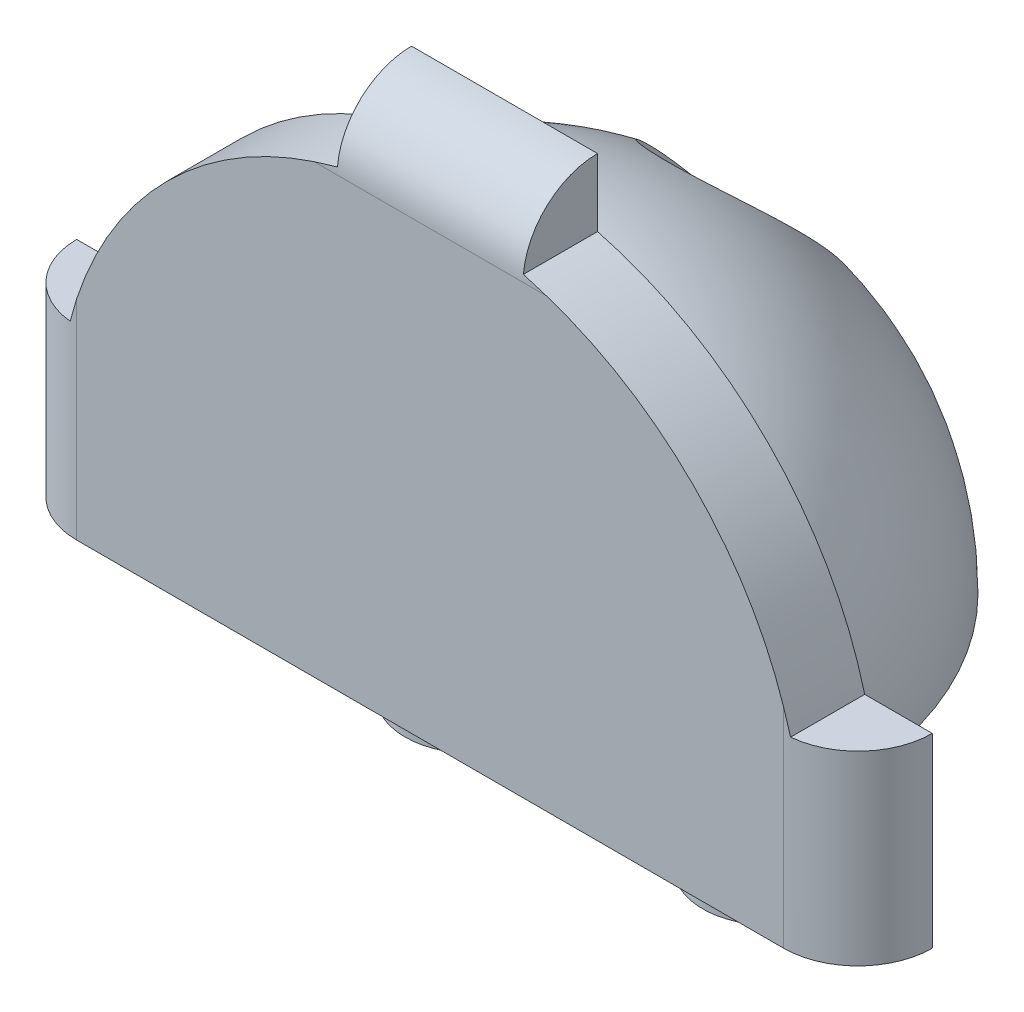
ISO-10303-21;
HEADER;
FILE_DESCRIPTION(('STEP AP214'),'2;1');
FILE_NAME('part.step','',(''),(''),'','','');
FILE_SCHEMA(('AUTOMOTIVE_DESIGN { 1 0 10303 214 1 1 1 1 }'));
ENDSEC;
DATA;
#1=APPLICATION_CONTEXT('core data for automotive mechanical design processes');
#2=APPLICATION_PROTOCOL_DEFINITION('international standard','automotive_design',2000,#1);
#3=PRODUCT_CONTEXT('',#1,'mechanical');
#4=PRODUCT('Part','Part','',(#3));
#5=PRODUCT_RELATED_PRODUCT_CATEGORY('part','',(#4));
#6=PRODUCT_DEFINITION_FORMATION('','',#4);
#7=PRODUCT_DEFINITION_CONTEXT('part definition',#1,'design');
#8=PRODUCT_DEFINITION('design','',#6,#7);
#9=PRODUCT_DEFINITION_SHAPE('','',#8);
#10=(LENGTH_UNIT() NAMED_UNIT(*) SI_UNIT(.MILLI.,.METRE.));
#11=(NAMED_UNIT(*) PLANE_ANGLE_UNIT() SI_UNIT($,.RADIAN.));
#12=(NAMED_UNIT(*) SI_UNIT($,.STERADIAN.) SOLID_ANGLE_UNIT());
#13=UNCERTAINTY_MEASURE_WITH_UNIT(LENGTH_MEASURE(1.E-05),#10,'distance_accuracy_value','');
#14=(GEOMETRIC_REPRESENTATION_CONTEXT(3) GLOBAL_UNCERTAINTY_ASSIGNED_CONTEXT((#13)) GLOBAL_UNIT_ASSIGNED_CONTEXT((#10,
#11,#12)) REPRESENTATION_CONTEXT('',''));
#15=CARTESIAN_POINT('',(0.,0.,0.));
#16=DIRECTION('',(0.,0.,1.));
#17=DIRECTION('',(1.,0.,0.));
#18=AXIS2_PLACEMENT_3D('',#15,#16,#17);
#19=CARTESIAN_POINT('',(0.,0.,2.));
#20=DIRECTION('',(0.,0.,-1.));
#21=DIRECTION('',(-1.,0.,0.));
#22=AXIS2_PLACEMENT_3D('',#19,#20,#21);
#23=CYLINDRICAL_SURFACE('',#22,10.);
#24=CARTESIAN_POINT('',(0.,0.,2.));
#25=DIRECTION('',(0.,0.,1.));
#26=DIRECTION('',(1.,0.,0.));
#27=AXIS2_PLACEMENT_3D('',#24,#25,#26);
#28=CIRCLE('',#27,10.);
#29=CARTESIAN_POINT('',(9.49999999999999,3.12249899919923,2.));
#30=VERTEX_POINT('',#29);
#31=CARTESIAN_POINT('',(3.12249899919921,9.5,2.));
#32=VERTEX_POINT('',#31);
#33=EDGE_CURVE('E326',#30,#32,#28,.T.);
#34=ORIENTED_EDGE('',*,*,#33,.F.);
#35=CARTESIAN_POINT('',(9.49999999999999,3.12249899919923,2.));
#36=CARTESIAN_POINT('',(9.51688678600174,3.07112224308726,1.99999946326881));
#37=CARTESIAN_POINT('',(9.53335654598108,3.01960888585066,1.99978613446517));
#38=CARTESIAN_POINT('',(9.56545273961679,2.91633955334606,1.99899326990257));
#39=CARTESIAN_POINT('',(9.58107942121032,2.86458365432631,1.99841384245216));
#40=CARTESIAN_POINT('',(9.61149013067313,2.76082957459439,1.99694808954947));
#41=CARTESIAN_POINT('',(9.62627416106261,2.70883139460734,1.99606176501513));
#42=CARTESIAN_POINT('',(9.65500016720584,2.60459125735915,1.99403657363693));
#43=CARTESIAN_POINT('',(9.66894189261384,2.55234923254531,1.99289763217678));
#44=CARTESIAN_POINT('',(9.68245836551853,2.50000000000003,1.9916598466737));
#45=B_SPLINE_CURVE_WITH_KNOTS('',3,(#35,#36,#37,#38,#39,#40,#41,#42,#43,#44),.UNSPECIFIED.,.F.,
.F.,(4,2,2,2,4),(0.,0.162239616217096,0.324431257079582,0.486622412831842,0.648861539472951),.UNSPECIFIED.);
#46=CARTESIAN_POINT('',(9.68245836551853,2.50000000000003,1.9916598466737));
#47=VERTEX_POINT('',#46);
#48=EDGE_CURVE('E160',#30,#47,#45,.T.);
#49=ORIENTED_EDGE('',*,*,#48,.T.);
#50=DIRECTION('',(0.,0.,-1.));
#51=VECTOR('',#50,1.);
#52=CARTESIAN_POINT('',(9.68245836551853,2.50000000000003,2.));
#53=LINE('',#52,#51);
#54=CARTESIAN_POINT('',(9.68245836551853,2.50000000000003,0.));
#55=VERTEX_POINT('',#54);
#56=EDGE_CURVE('E436',#47,#55,#53,.T.);
#57=ORIENTED_EDGE('',*,*,#56,.T.);
#58=CARTESIAN_POINT('',(0.,0.,0.));
#59=DIRECTION('',(0.,0.,1.));
#60=DIRECTION('',(1.,0.,0.));
#61=AXIS2_PLACEMENT_3D('',#58,#59,#60);
#62=CIRCLE('',#61,10.);
#63=CARTESIAN_POINT('',(2.5,9.68245836551854,0.));
#64=VERTEX_POINT('',#63);
#65=EDGE_CURVE('E325',#55,#64,#62,.T.);
#66=ORIENTED_EDGE('',*,*,#65,.T.);
#67=DIRECTION('',(0.,0.,-1.));
#68=VECTOR('',#67,1.);
#69=CARTESIAN_POINT('',(2.5,9.68245836551854,2.));
#70=LINE('',#69,#68);
#71=CARTESIAN_POINT('',(2.5,9.68245836551854,1.9916598466737));
#72=VERTEX_POINT('',#71);
#73=EDGE_CURVE('E415',#64,#72,#70,.F.);
#74=ORIENTED_EDGE('',*,*,#73,.T.);
#75=CARTESIAN_POINT('',(2.5,9.68245836551854,1.9916598466737));
#76=CARTESIAN_POINT('',(2.55234923254527,9.66894189261385,1.99289763217678));
#77=CARTESIAN_POINT('',(2.60459125735912,9.65500016720585,1.99403657363693));
#78=CARTESIAN_POINT('',(2.70883139460731,9.62627416106262,1.99606176501513));
#79=CARTESIAN_POINT('',(2.76082957459436,9.61149013067313,1.99694808954947));
#80=CARTESIAN_POINT('',(2.86458365432628,9.58107942121033,1.99841384245216));
#81=CARTESIAN_POINT('',(2.91633955334604,9.5654527396168,1.99899326990257));
#82=CARTESIAN_POINT('',(3.01960888585064,9.53335654598109,1.99978613446517));
#83=CARTESIAN_POINT('',(3.07112224308724,9.51688678600176,1.99999946326881));
#84=CARTESIAN_POINT('',(3.12249899919921,9.5,2.));
#85=B_SPLINE_CURVE_WITH_KNOTS('',3,(#75,#76,#77,#78,#79,#80,#81,#82,#83,#84),.UNSPECIFIED.,.F.,
.F.,(4,2,2,2,4),(0.,0.162239126641112,0.324430282393375,0.486621923255864,0.648861539472962),.UNSPECIFIED.);
#86=EDGE_CURVE('E163',#72,#32,#85,.T.);
#87=ORIENTED_EDGE('',*,*,#86,.T.);
#88=EDGE_LOOP('',(#34,#49,#57,#66,#74,#87));
#89=FACE_BOUND('',#88,.T.);
#90=ADVANCED_FACE('F38',(#89),#23,.T.);
#91=DIRECTION('',(0.,0.,-1.));
#92=VECTOR('',#91,1.);
#93=CARTESIAN_POINT('',(-9.68245836551855,2.49999999999997,2.));
#94=LINE('',#93,#92);
#95=CARTESIAN_POINT('',(-9.68245836551855,2.49999999999997,0.));
#96=VERTEX_POINT('',#95);
#97=CARTESIAN_POINT('',(-9.68245836551855,2.49999999999997,1.9916598466737));
#98=VERTEX_POINT('',#97);
#99=EDGE_CURVE('E433',#96,#98,#94,.F.);
#100=ORIENTED_EDGE('',*,*,#99,.T.);
#101=CARTESIAN_POINT('',(-9.68245836551855,2.49999999999997,1.9916598466737));
#102=CARTESIAN_POINT('',(-9.66894189261386,2.55234923254524,1.99289763217678));
#103=CARTESIAN_POINT('',(-9.65500016720586,2.60459125735908,1.99403657363693));
#104=CARTESIAN_POINT('',(-9.62627416106263,2.70883139460728,1.99606176501513));
#105=CARTESIAN_POINT('',(-9.61149013067315,2.76082957459433,1.99694808954947));
#106=CARTESIAN_POINT('',(-9.58107942121034,2.86458365432625,1.99841384245216));
#107=CARTESIAN_POINT('',(-9.56545273961681,2.916339553346,1.99899326990257));
#108=CARTESIAN_POINT('',(-9.5333565459811,3.01960888585061,1.99978613446517));
#109=CARTESIAN_POINT('',(-9.51688678600176,3.07112224308721,1.99999946326881));
#110=CARTESIAN_POINT('',(-9.50000000000001,3.12249899919917,2.));
#111=B_SPLINE_CURVE_WITH_KNOTS('',3,(#101,#102,#103,#104,#105,#106,#107,#108,#109,#110),
.UNSPECIFIED.,.F.,.F.,(4,2,2,2,4),(0.,0.162239126641112,0.324430282393375,0.486621923255865,
0.648861539472963),.UNSPECIFIED.);
#112=CARTESIAN_POINT('',(-9.50000000000001,3.12249899919917,2.));
#113=VERTEX_POINT('',#112);
#114=EDGE_CURVE('E202',#98,#113,#111,.T.);
#115=ORIENTED_EDGE('',*,*,#114,.T.);
#116=CARTESIAN_POINT('',(-3.12249899919921,9.5,2.));
#117=VERTEX_POINT('',#116);
#118=EDGE_CURVE('E329',#117,#113,#28,.T.);
#119=ORIENTED_EDGE('',*,*,#118,.F.);
#120=CARTESIAN_POINT('',(-3.12249899919921,9.5,2.));
#121=CARTESIAN_POINT('',(-3.07112224308724,9.51688678600175,1.99999946326881));
#122=CARTESIAN_POINT('',(-3.01960888585064,9.53335654598109,1.99978613446517));
#123=CARTESIAN_POINT('',(-2.91633955334604,9.5654527396168,1.99899326990257));
#124=CARTESIAN_POINT('',(-2.86458365432628,9.58107942121033,1.99841384245216));
#125=CARTESIAN_POINT('',(-2.76082957459436,9.61149013067313,1.99694808954947));
#126=CARTESIAN_POINT('',(-2.70883139460731,9.62627416106262,1.99606176501513));
#127=CARTESIAN_POINT('',(-2.60459125735912,9.65500016720585,1.99403657363693));
#128=CARTESIAN_POINT('',(-2.55234923254528,9.66894189261385,1.99289763217678));
#129=CARTESIAN_POINT('',(-2.5,9.68245836551854,1.9916598466737));
#130=B_SPLINE_CURVE_WITH_KNOTS('',3,(#120,#121,#122,#123,#124,#125,#126,#127,#128,#129),
.UNSPECIFIED.,.F.,.F.,(4,2,2,2,4),(0.,0.162239616217099,0.324431257079587,0.48662241283185,
0.648861539472962),.UNSPECIFIED.);
#131=CARTESIAN_POINT('',(-2.5,9.68245836551854,1.9916598466737));
#132=VERTEX_POINT('',#131);
#133=EDGE_CURVE('E63',#117,#132,#130,.T.);
#134=ORIENTED_EDGE('',*,*,#133,.T.);
#135=DIRECTION('',(0.,0.,-1.));
#136=VECTOR('',#135,1.);
#137=CARTESIAN_POINT('',(-2.5,9.68245836551854,2.));
#138=LINE('',#137,#136);
#139=CARTESIAN_POINT('',(-2.5,9.68245836551854,0.));
#140=VERTEX_POINT('',#139);
#141=EDGE_CURVE('E419',#132,#140,#138,.T.);
#142=ORIENTED_EDGE('',*,*,#141,.T.);
#143=EDGE_CURVE('E330',#140,#96,#62,.T.);
#144=ORIENTED_EDGE('',*,*,#143,.T.);
#145=EDGE_LOOP('',(#100,#115,#119,#134,#142,#144));
#146=FACE_BOUND('',#145,.T.);
#147=ADVANCED_FACE('F186',(#146),#23,.T.);
#148=CARTESIAN_POINT('',(-4.,-6.,-3.17735045483277));
#149=DIRECTION('',(0.,1.,0.));
#150=DIRECTION('',(0.,0.,1.));
#151=AXIS2_PLACEMENT_3D('',#148,#149,#150);
#152=CYLINDRICAL_SURFACE('',#151,1.85);
#153=CARTESIAN_POINT('',(-4.,0.,-3.17735045483277));
#154=DIRECTION('',(0.,1.,0.));
#155=DIRECTION('',(0.,0.,1.));
#156=AXIS2_PLACEMENT_3D('',#153,#154,#155);
#157=CIRCLE('',#156,1.85);
#158=CARTESIAN_POINT('',(-4.,0.,-1.32735045483277));
#159=VERTEX_POINT('',#158);
#160=EDGE_CURVE('E333',#159,#159,#157,.F.);
#161=ORIENTED_EDGE('',*,*,#160,.T.);
#162=EDGE_LOOP('',(#161));
#163=FACE_BOUND('',#162,.T.);
#164=CARTESIAN_POINT('',(-4.,-3.67575677416362,-3.17735045483277));
#165=DIRECTION('',(0.,-1.,0.));
#166=DIRECTION('',(0.,0.,-1.));
#167=AXIS2_PLACEMENT_3D('',#164,#165,#166);
#168=CIRCLE('',#167,1.85);
#169=CARTESIAN_POINT('',(-4.,-3.67575677416362,-5.02735045483277));
#170=VERTEX_POINT('',#169);
#171=EDGE_CURVE('E341',#170,#170,#168,.T.);
#172=ORIENTED_EDGE('',*,*,#171,.F.);
#173=EDGE_LOOP('',(#172));
#174=FACE_BOUND('',#173,.T.);
#175=ADVANCED_FACE('F288',(#163,#174),#152,.T.);
#176=CARTESIAN_POINT('',(4.,-6.,-3.17735045483277));
#177=DIRECTION('',(0.,1.,0.));
#178=DIRECTION('',(0.,0.,1.));
#179=AXIS2_PLACEMENT_3D('',#176,#177,#178);
#180=CYLINDRICAL_SURFACE('',#179,1.85);
#181=CARTESIAN_POINT('',(4.,0.,-3.17735045483277));
#182=DIRECTION('',(0.,1.,0.));
#183=DIRECTION('',(0.,0.,-1.));
#184=AXIS2_PLACEMENT_3D('',#181,#182,#183);
#185=CIRCLE('',#184,1.85);
#186=CARTESIAN_POINT('',(4.,0.,-5.02735045483277));
#187=VERTEX_POINT('',#186);
#188=EDGE_CURVE('E361',#187,#187,#185,.T.);
#189=ORIENTED_EDGE('',*,*,#188,.F.);
#190=EDGE_LOOP('',(#189));
#191=FACE_BOUND('',#190,.T.);
#192=CARTESIAN_POINT('',(4.,-3.67575677416362,-3.17735045483277));
#193=DIRECTION('',(0.,-1.,0.));
#194=DIRECTION('',(0.,0.,-1.));
#195=AXIS2_PLACEMENT_3D('',#192,#193,#194);
#196=CIRCLE('',#195,1.85);
#197=CARTESIAN_POINT('',(4.,-3.67575677416362,-5.02735045483277));
#198=VERTEX_POINT('',#197);
#199=EDGE_CURVE('E391',#198,#198,#196,.T.);
#200=ORIENTED_EDGE('',*,*,#199,.F.);
#201=EDGE_LOOP('',(#200));
#202=FACE_BOUND('',#201,.T.);
#203=ADVANCED_FACE('F284',(#191,#202),#180,.T.);
#204=CARTESIAN_POINT('',(0.,0.,0.));
#205=DIRECTION('',(0.,1.,0.));
#206=DIRECTION('',(0.,0.,1.));
#207=AXIS2_PLACEMENT_3D('',#204,#205,#206);
#208=PLANE('',#207);
#209=ORIENTED_EDGE('',*,*,#160,.F.);
#210=EDGE_LOOP('',(#209));
#211=FACE_BOUND('',#210,.T.);
#212=ORIENTED_EDGE('',*,*,#188,.T.);
#213=EDGE_LOOP('',(#212));
#214=FACE_BOUND('',#213,.T.);
#215=CARTESIAN_POINT('',(0.,0.,-6.5));
#216=DIRECTION('',(0.,-1.,0.));
#217=DIRECTION('',(0.,0.,-1.));
#218=AXIS2_PLACEMENT_3D('',#215,#216,#217);
#219=CIRCLE('',#218,3.);
#220=CARTESIAN_POINT('',(1.93983086556077,0.,-8.78846153846154));
#221=VERTEX_POINT('',#220);
#222=CARTESIAN_POINT('',(-1.93983086556077,0.,-8.78846153846154));
#223=VERTEX_POINT('',#222);
#224=EDGE_CURVE('E379',#221,#223,#219,.T.);
#225=ORIENTED_EDGE('',*,*,#224,.F.);
#226=CARTESIAN_POINT('',(0.,0.,0.));
#227=DIRECTION('',(0.,1.,0.));
#228=DIRECTION('',(0.,0.,1.));
#229=AXIS2_PLACEMENT_3D('',#226,#227,#228);
#230=CIRCLE('',#229,9.);
#231=CARTESIAN_POINT('',(9.,0.,0.));
#232=VERTEX_POINT('',#231);
#233=EDGE_CURVE('E321',#232,#221,#230,.T.);
#234=ORIENTED_EDGE('',*,*,#233,.F.);
#235=DIRECTION('',(1.,0.,0.));
#236=VECTOR('',#235,1.);
#237=CARTESIAN_POINT('',(0.,0.,0.));
#238=LINE('',#237,#236);
#239=CARTESIAN_POINT('',(-9.,0.,0.));
#240=VERTEX_POINT('',#239);
#241=EDGE_CURVE('E317',#240,#232,#238,.T.);
#242=ORIENTED_EDGE('',*,*,#241,.F.);
#243=EDGE_CURVE('E320',#223,#240,#230,.T.);
#244=ORIENTED_EDGE('',*,*,#243,.F.);
#245=EDGE_LOOP('',(#225,#234,#242,#244));
#246=FACE_BOUND('',#245,.T.);
#247=ADVANCED_FACE('F287',(#211,#214,#246),#208,.F.);
#248=CARTESIAN_POINT('',(0.,0.,0.));
#249=DIRECTION('',(0.,0.,1.));
#250=DIRECTION('',(1.,0.,0.));
#251=AXIS2_PLACEMENT_3D('',#248,#249,#250);
#252=PLANE('',#251);
#253=DIRECTION('',(0.,1.,0.));
#254=VECTOR('',#253,1.);
#255=CARTESIAN_POINT('',(11.5,-2.49999999999996,0.));
#256=LINE('',#255,#254);
#257=CARTESIAN_POINT('',(11.5,-2.49999999999996,0.));
#258=VERTEX_POINT('',#257);
#259=CARTESIAN_POINT('',(11.5,2.50000000000004,0.));
#260=VERTEX_POINT('',#259);
#261=EDGE_CURVE('E439',#258,#260,#256,.T.);
#262=ORIENTED_EDGE('',*,*,#261,.F.);
#263=DIRECTION('',(1.,0.,0.));
#264=VECTOR('',#263,1.);
#265=CARTESIAN_POINT('',(11.5,-2.49999999999996,0.));
#266=LINE('',#265,#264);
#267=CARTESIAN_POINT('',(-11.5,-2.50000000000004,0.));
#268=VERTEX_POINT('',#267);
#269=EDGE_CURVE('E140',#268,#258,#266,.T.);
#270=ORIENTED_EDGE('',*,*,#269,.F.);
#271=DIRECTION('',(0.,-1.,0.));
#272=VECTOR('',#271,1.);
#273=CARTESIAN_POINT('',(-11.5,-2.50000000000004,0.));
#274=LINE('',#273,#272);
#275=CARTESIAN_POINT('',(-11.5,2.49999999999996,0.));
#276=VERTEX_POINT('',#275);
#277=EDGE_CURVE('E444',#276,#268,#274,.T.);
#278=ORIENTED_EDGE('',*,*,#277,.F.);
#279=DIRECTION('',(-1.,0.,0.));
#280=VECTOR('',#279,1.);
#281=CARTESIAN_POINT('',(11.5,2.50000000000004,0.));
#282=LINE('',#281,#280);
#283=EDGE_CURVE('E156',#96,#276,#282,.T.);
#284=ORIENTED_EDGE('',*,*,#283,.F.);
#285=ORIENTED_EDGE('',*,*,#143,.F.);
#286=DIRECTION('',(0.,-1.,0.));
#287=VECTOR('',#286,1.);
#288=CARTESIAN_POINT('',(-2.5,-11.5,0.));
#289=LINE('',#288,#287);
#290=CARTESIAN_POINT('',(-2.5,11.5,0.));
#291=VERTEX_POINT('',#290);
#292=EDGE_CURVE('E422',#291,#140,#289,.T.);
#293=ORIENTED_EDGE('',*,*,#292,.F.);
#294=DIRECTION('',(-1.,0.,0.));
#295=VECTOR('',#294,1.);
#296=CARTESIAN_POINT('',(-2.5,11.5,0.));
#297=LINE('',#296,#295);
#298=CARTESIAN_POINT('',(2.5,11.5,0.));
#299=VERTEX_POINT('',#298);
#300=EDGE_CURVE('E426',#299,#291,#297,.T.);
#301=ORIENTED_EDGE('',*,*,#300,.F.);
#302=DIRECTION('',(0.,1.,0.));
#303=VECTOR('',#302,1.);
#304=CARTESIAN_POINT('',(2.5,-11.5,0.));
#305=LINE('',#304,#303);
#306=EDGE_CURVE('E430',#64,#299,#305,.T.);
#307=ORIENTED_EDGE('',*,*,#306,.F.);
#308=ORIENTED_EDGE('',*,*,#65,.F.);
#309=EDGE_CURVE('E447',#260,#55,#282,.T.);
#310=ORIENTED_EDGE('',*,*,#309,.F.);
#311=EDGE_LOOP('',(#262,#270,#278,#284,#285,#293,#301,#307,#308,#310));
#312=FACE_BOUND('',#311,.T.);
#313=CARTESIAN_POINT('',(0.,0.,0.));
#314=DIRECTION('',(0.,0.,1.));
#315=DIRECTION('',(1.,0.,0.));
#316=AXIS2_PLACEMENT_3D('',#313,#314,#315);
#317=CIRCLE('',#316,9.);
#318=EDGE_CURVE('E312',#232,#240,#317,.T.);
#319=ORIENTED_EDGE('',*,*,#318,.T.);
#320=ORIENTED_EDGE('',*,*,#241,.T.);
#321=EDGE_LOOP('',(#319,#320));
#322=FACE_BOUND('',#321,.T.);
#323=ADVANCED_FACE('F188',(#312,#322),#252,.F.);
#324=CARTESIAN_POINT('',(0.,0.,2.));
#325=DIRECTION('',(0.,0.,1.));
#326=DIRECTION('',(1.,0.,0.));
#327=AXIS2_PLACEMENT_3D('',#324,#325,#326);
#328=PLANE('',#327);
#329=DIRECTION('',(-1.,0.,0.));
#330=VECTOR('',#329,1.);
#331=CARTESIAN_POINT('',(0.,-2.5,2.));
#332=LINE('',#331,#330);
#333=CARTESIAN_POINT('',(9.50000000000001,-2.49999999999997,2.));
#334=VERTEX_POINT('',#333);
#335=CARTESIAN_POINT('',(-9.49999999999999,-2.50000000000004,2.));
#336=VERTEX_POINT('',#335);
#337=EDGE_CURVE('E137',#334,#336,#332,.T.);
#338=ORIENTED_EDGE('',*,*,#337,.F.);
#339=DIRECTION('',(0.,1.,0.));
#340=VECTOR('',#339,1.);
#341=CARTESIAN_POINT('',(9.5,0.,2.));
#342=LINE('',#341,#340);
#343=EDGE_CURVE('E151',#334,#30,#342,.T.);
#344=ORIENTED_EDGE('',*,*,#343,.T.);
#345=ORIENTED_EDGE('',*,*,#33,.T.);
#346=DIRECTION('',(-1.,0.,0.));
#347=VECTOR('',#346,1.);
#348=CARTESIAN_POINT('',(0.,9.5,2.));
#349=LINE('',#348,#347);
#350=EDGE_CURVE('E168',#32,#117,#349,.T.);
#351=ORIENTED_EDGE('',*,*,#350,.T.);
#352=ORIENTED_EDGE('',*,*,#118,.T.);
#353=DIRECTION('',(0.,-1.,0.));
#354=VECTOR('',#353,1.);
#355=CARTESIAN_POINT('',(-9.5,0.,2.));
#356=LINE('',#355,#354);
#357=EDGE_CURVE('E154',#113,#336,#356,.T.);
#358=ORIENTED_EDGE('',*,*,#357,.T.);
#359=EDGE_LOOP('',(#338,#344,#345,#351,#352,#358));
#360=FACE_BOUND('',#359,.T.);
#361=ADVANCED_FACE('F149',(#360),#328,.T.);
#362=CARTESIAN_POINT('',(0.,0.,0.));
#363=DIRECTION('',(0.,1.,0.));
#364=DIRECTION('',(1.,0.,0.));
#365=AXIS2_PLACEMENT_3D('',#362,#363,#364);
#366=SPHERICAL_SURFACE('',#365,9.);
#367=CARTESIAN_POINT('',(0.,2.65329983228432,-8.6));
#368=CARTESIAN_POINT('',(0.0517041748023338,2.65329859046355,-8.60000046771537));
#369=CARTESIAN_POINT('',(0.103405099392612,2.65804619798417,-8.59806758475628));
#370=CARTESIAN_POINT('',(0.205010584961247,2.67625952710847,-8.59059327712101));
#371=CARTESIAN_POINT('',(0.254911150733533,2.68974351352862,-8.58504429225611));
#372=CARTESIAN_POINT('',(0.367044692458896,2.72904151801302,-8.56867849418655));
#373=CARTESIAN_POINT('',(0.428198014546245,2.75740414217103,-8.55675171392708));
#374=CARTESIAN_POINT('',(0.545040360860403,2.8222228096887,-8.52893148264736));
#375=CARTESIAN_POINT('',(0.600714601564255,2.85869992804375,-8.51302768891259));
#376=CARTESIAN_POINT('',(0.703792686569309,2.93446936532014,-8.47924904189046));
#377=CARTESIAN_POINT('',(0.751495624577364,2.97344507209442,-8.46155852320283));
#378=CARTESIAN_POINT('',(0.843174788953082,3.05459615146302,-8.42393067081544));
#379=CARTESIAN_POINT('',(0.887147598123495,3.09677439230785,-8.40399131506961));
#380=CARTESIAN_POINT('',(1.0144089821774,3.22676669253242,-8.34118803794029));
#381=CARTESIAN_POINT('',(1.09286304639126,3.31789692965616,-8.29540083920551));
#382=CARTESIAN_POINT('',(1.23901919955226,3.50392442902953,-8.19778196437732));
#383=CARTESIAN_POINT('',(1.30679449050768,3.59878992109969,-8.1459960810227));
#384=CARTESIAN_POINT('',(1.43373059470551,3.7910702248949,-8.0366949583813));
#385=CARTESIAN_POINT('',(1.4928841508106,3.8884871037594,-7.97917496033106));
#386=CARTESIAN_POINT('',(1.60317255994397,4.08466377932361,-7.85885830927752));
#387=CARTESIAN_POINT('',(1.65430265327534,4.18342433565918,-7.79605855787327));
#388=CARTESIAN_POINT('',(1.7486918719104,4.38148011617314,-7.66557266298839));
#389=CARTESIAN_POINT('',(1.79195030706503,4.48077538644763,-7.59788609178093));
#390=CARTESIAN_POINT('',(1.87279825447269,4.68518201901891,-7.4538545913401));
#391=CARTESIAN_POINT('',(1.90990475126768,4.79029199504536,-7.37723456517277));
#392=CARTESIAN_POINT('',(1.97478403452331,4.99990204946494,-7.21938468819162));
#393=CARTESIAN_POINT('',(2.00255511847544,5.10440201319861,-7.13815399968059));
#394=CARTESIAN_POINT('',(2.07095419053532,5.41598978923732,-6.88845660997523));
#395=CARTESIAN_POINT('',(2.09685387304912,5.62162818825508,-6.7136576293617));
#396=CARTESIAN_POINT('',(2.10196433949834,5.97866023412892,-6.39385252404887));
#397=CARTESIAN_POINT('',(2.09035307739863,6.13186581173105,-6.25097010296213));
#398=CARTESIAN_POINT('',(2.03537731825612,6.43018583084771,-5.96267831393437));
#399=CARTESIAN_POINT('',(1.99205148107569,6.57530989211559,-5.81727223281682));
#400=CARTESIAN_POINT('',(1.88466394467294,6.81821959192642,-5.56636461243013));
#401=CARTESIAN_POINT('',(1.82860182470319,6.91870471421759,-5.46005888818201));
#402=CARTESIAN_POINT('',(1.69427450758489,7.11041374139215,-5.25316555383689));
#403=CARTESIAN_POINT('',(1.61603851944562,7.20164961680506,-5.15257062892643));
#404=CARTESIAN_POINT('',(1.45621692578602,7.3524753240611,-4.98349831857158));
#405=CARTESIAN_POINT('',(1.37929295884706,7.4145794314853,-4.91286926189953));
#406=CARTESIAN_POINT('',(1.21125729191796,7.5291046411275,-4.7812194446166));
#407=CARTESIAN_POINT('',(1.12016227701925,7.58153697426517,-4.72018755203477));
#408=CARTESIAN_POINT('',(0.941084663362739,7.66660602459914,-4.62035825175481));
#409=CARTESIAN_POINT('',(0.855103675884375,7.70108469262412,-4.57955113468738));
#410=CARTESIAN_POINT('',(0.675425277700717,7.76019551655464,-4.5092494152571));
#411=CARTESIAN_POINT('',(0.581731356459488,7.78483209598361,-4.47974973101443));
#412=CARTESIAN_POINT('',(0.388438738262105,7.82307406848108,-4.43383739354609));
#413=CARTESIAN_POINT('',(0.288811729380563,7.83662111118417,-4.4174939726716));
#414=CARTESIAN_POINT('',(0.0873445229693916,7.85162806142281,-4.39938440791062));
#415=CARTESIAN_POINT('',(-0.0144948609004724,7.85309233971346,-4.3976129928248));
#416=CARTESIAN_POINT('',(-0.207532780093147,7.8442821454864,-4.40824991894439));
#417=CARTESIAN_POINT('',(-0.298855307015593,7.83506521536102,-4.41938082991386));
#418=CARTESIAN_POINT('',(-0.477829841643917,7.80707617251865,-4.45305812510174));
#419=CARTESIAN_POINT('',(-0.565481814329818,7.78830396865931,-4.47560461820694));
#420=CARTESIAN_POINT('',(-0.736569837474998,7.74166714851281,-4.53131834748798));
#421=CARTESIAN_POINT('',(-0.819903811135472,7.71364748401577,-4.56466649982875));
#422=CARTESIAN_POINT('',(-0.979200504826859,7.6497540283313,-4.6401755762983));
#423=CARTESIAN_POINT('',(-1.0551608528966,7.61387772180946,-4.6823393225775));
#424=CARTESIAN_POINT('',(-1.20838921791971,7.53024447955086,-4.77979867291403));
#425=CARTESIAN_POINT('',(-1.28450228801146,7.48154389418199,-4.83609344844325));
#426=CARTESIAN_POINT('',(-1.42579416167341,7.37713284587521,-4.95543445731758));
#427=CARTESIAN_POINT('',(-1.49096509533741,7.32141738760513,-5.0184854970255));
#428=CARTESIAN_POINT('',(-1.64276012960965,7.17263561150994,-5.18472191074882));
#429=CARTESIAN_POINT('',(-1.72197092019345,7.07564374113845,-5.29119746978838));
#430=CARTESIAN_POINT('',(-1.85636734754289,6.87187850037353,-5.5098265156232));
#431=CARTESIAN_POINT('',(-1.91149844269194,6.76508358042611,-5.62199225663627));
#432=CARTESIAN_POINT('',(-2.01531738406201,6.50583190281204,-5.88740135573389));
#433=CARTESIAN_POINT('',(-2.05502471568741,6.35045770094124,-6.04130497843464));
#434=CARTESIAN_POINT('',(-2.09992425838917,6.03143867210229,-6.34518127189366));
#435=CARTESIAN_POINT('',(-2.10508245121395,5.86778585338399,-6.49514992350553));
#436=CARTESIAN_POINT('',(-2.08267531749143,5.48838960141953,-6.82790217196751));
#437=CARTESIAN_POINT('',(-2.04553449563741,5.2709006356003,-7.00810417938746));
#438=CARTESIAN_POINT('',(-1.95825551740281,4.94195505016679,-7.26379040142485));
#439=CARTESIAN_POINT('',(-1.92382285203774,4.83168058766245,-7.34670071170876));
#440=CARTESIAN_POINT('',(-1.84490234240124,4.61078977292643,-7.50713596225662));
#441=CARTESIAN_POINT('',(-1.80041732223887,4.50017352530819,-7.58466240708216));
#442=CARTESIAN_POINT('',(-1.70960197656507,4.29705073960421,-7.72184347260341));
#443=CARTESIAN_POINT('',(-1.66471064129826,4.20448372433787,-7.78237077827118));
#444=CARTESIAN_POINT('',(-1.56799561892209,4.02017637418513,-7.89897407863191));
#445=CARTESIAN_POINT('',(-1.51617316032767,3.92843589586692,-7.95505085936308));
#446=CARTESIAN_POINT('',(-1.40550539594249,3.74694770201845,-8.06219863202147));
#447=CARTESIAN_POINT('',(-1.34669158264608,3.65719305992612,-8.11329031534496));
#448=CARTESIAN_POINT('',(-1.22115409054099,3.48052229191272,-8.21028736198019));
#449=CARTESIAN_POINT('',(-1.15443806167238,3.39360352298084,-8.25619765851041));
#450=CARTESIAN_POINT('',(-1.03181515881768,3.24862959185731,-8.33000625950524));
#451=CARTESIAN_POINT('',(-0.978195937501298,3.18936984946227,-8.35932403480096));
#452=CARTESIAN_POINT('',(-0.865033612970391,3.07465180790871,-8.41460029779994));
#453=CARTESIAN_POINT('',(-0.805475887255552,3.01920348996699,-8.44055011231615));
#454=CARTESIAN_POINT('',(-0.678437427488189,2.91399278683016,-8.48857227756912));
#455=CARTESIAN_POINT('',(-0.610858085672098,2.8643201320831,-8.51058572873177));
#456=CARTESIAN_POINT('',(-0.467110213286822,2.7764227955823,-8.54872270609697));
#457=CARTESIAN_POINT('',(-0.390989474504446,2.73813839991179,-8.56487705583273));
#458=CARTESIAN_POINT('',(-0.26123616638141,2.69157653291547,-8.58428824501409));
#459=CARTESIAN_POINT('',(-0.21015010430413,2.67742243610106,-8.59011506850658));
#460=CARTESIAN_POINT('',(-0.106038309798856,2.65829553090541,-8.59796622972392));
#461=CARTESIAN_POINT('',(-0.0530174461905048,2.65330110564698,-8.5999995204048));
#462=CARTESIAN_POINT('',(0.,2.65329983228432,-8.6));
#463=B_SPLINE_CURVE_WITH_KNOTS('',3,(#367,#368,#369,#370,#371,#372,#373,#374,#375,#376,#377,
#378,#379,#380,#381,#382,#383,#384,#385,#386,#387,#388,#389,#390,#391,#392,#393,#394,#395,#396,
#397,#398,#399,#400,#401,#402,#403,#404,#405,#406,#407,#408,#409,#410,#411,#412,#413,#414,#415,
#416,#417,#418,#419,#420,#421,#422,#423,#424,#425,#426,#427,#428,#429,#430,#431,#432,#433,#434,
#435,#436,#437,#438,#439,#440,#441,#442,#443,#444,#445,#446,#447,#448,#449,#450,#451,#452,#453,
#454,#455,#456,#457,#458,#459,#460,#461,#462),.UNSPECIFIED.,.T.,.F.,(4,2,2,2,2,2,2,2,2,2,2,2,2,
2,2,2,2,2,2,2,2,2,2,2,2,2,2,2,2,2,2,2,2,2,2,2,2,2,2,2,2,2,2,2,2,2,2,4),(0.,0.154878625947738,
0.310082100185943,0.514279923817333,0.719014414617453,0.91100377153035,1.1031671533839,
1.4881928890208,1.87045224689976,2.25303152687614,2.63583691036407,3.01867584022955,
3.4240299468747,3.82945793829592,4.6385434431827,5.26595124949116,5.89259552067238,
6.3609903339272,6.8287709889522,7.19194243692626,7.55468947624443,7.85711287594358,
8.15940019821033,8.46326803809966,8.76702595362825,9.043103723932,9.31918412763519,
9.60015094659076,9.88120785001109,10.199424574841,10.517869199081,11.0082360114161,
11.499707838801,12.1628870201365,12.8267190942723,13.6765827300415,14.1028446943174,
14.528987053093,14.8868162330351,15.2445820729764,15.6007934267683,15.9566627170348,
16.211775809744,16.4675333588098,16.7268453296098,16.9847726175594,17.1439612887312,
17.3027737878888),.UNSPECIFIED.);
#464=CARTESIAN_POINT('',(0.,2.65329983228432,-8.6));
#465=VERTEX_POINT('',#464);
#466=EDGE_CURVE('E304',#465,#465,#463,.T.);
#467=ORIENTED_EDGE('',*,*,#466,.T.);
#468=EDGE_LOOP('',(#467));
#469=FACE_BOUND('',#468,.T.);
#470=ORIENTED_EDGE('',*,*,#233,.T.);
#471=CARTESIAN_POINT('',(0.,0.,0.));
#472=DIRECTION('',(0.,-1.,0.));
#473=DIRECTION('',(0.,0.,-1.));
#474=AXIS2_PLACEMENT_3D('',#471,#472,#473);
#475=CIRCLE('',#474,9.);
#476=EDGE_CURVE('E383',#223,#221,#475,.T.);
#477=ORIENTED_EDGE('',*,*,#476,.F.);
#478=ORIENTED_EDGE('',*,*,#243,.T.);
#479=ORIENTED_EDGE('',*,*,#318,.F.);
#480=EDGE_LOOP('',(#470,#477,#478,#479));
#481=FACE_BOUND('',#480,.T.);
#482=ADVANCED_FACE('F299',(#469,#481),#366,.T.);
#483=CARTESIAN_POINT('',(0.,10.,-6.5));
#484=DIRECTION('',(0.,-1.,0.));
#485=DIRECTION('',(0.,0.,-1.));
#486=AXIS2_PLACEMENT_3D('',#483,#484,#485);
#487=CYLINDRICAL_SURFACE('',#486,2.1);
#488=ORIENTED_EDGE('',*,*,#466,.F.);
#489=EDGE_LOOP('',(#488));
#490=FACE_BOUND('',#489,.T.);
#491=CARTESIAN_POINT('',(0.,-1.38,-6.5));
#492=DIRECTION('',(0.,-1.,0.));
#493=DIRECTION('',(0.,0.,-1.));
#494=AXIS2_PLACEMENT_3D('',#491,#492,#493);
#495=CIRCLE('',#494,2.1);
#496=CARTESIAN_POINT('',(0.,-1.38,-8.6));
#497=VERTEX_POINT('',#496);
#498=EDGE_CURVE('E387',#497,#497,#495,.T.);
#499=ORIENTED_EDGE('',*,*,#498,.T.);
#500=EDGE_LOOP('',(#499));
#501=FACE_BOUND('',#500,.T.);
#502=ADVANCED_FACE('F273',(#490,#501),#487,.F.);
#503=CARTESIAN_POINT('',(0.,-1.38,-3.25));
#504=DIRECTION('',(0.,-1.,0.));
#505=DIRECTION('',(0.,0.,-1.));
#506=AXIS2_PLACEMENT_3D('',#503,#504,#505);
#507=PLANE('',#506);
#508=CARTESIAN_POINT('',(0.,-1.38,0.));
#509=DIRECTION('',(0.,-1.,0.));
#510=DIRECTION('',(0.,0.,-1.));
#511=AXIS2_PLACEMENT_3D('',#508,#509,#510);
#512=CIRCLE('',#511,9.);
#513=CARTESIAN_POINT('',(-1.93983086556077,-1.38,-8.78846153846154));
#514=VERTEX_POINT('',#513);
#515=CARTESIAN_POINT('',(1.93983086556077,-1.38,-8.78846153846154));
#516=VERTEX_POINT('',#515);
#517=EDGE_CURVE('E375',#514,#516,#512,.T.);
#518=ORIENTED_EDGE('',*,*,#517,.T.);
#519=CARTESIAN_POINT('',(0.,-1.38,-6.5));
#520=DIRECTION('',(0.,-1.,0.));
#521=DIRECTION('',(0.,0.,-1.));
#522=AXIS2_PLACEMENT_3D('',#519,#520,#521);
#523=CIRCLE('',#522,3.);
#524=EDGE_CURVE('E372',#516,#514,#523,.T.);
#525=ORIENTED_EDGE('',*,*,#524,.T.);
#526=EDGE_LOOP('',(#518,#525));
#527=FACE_BOUND('',#526,.T.);
#528=ORIENTED_EDGE('',*,*,#498,.F.);
#529=EDGE_LOOP('',(#528));
#530=FACE_BOUND('',#529,.T.);
#531=ADVANCED_FACE('F269',(#527,#530),#507,.T.);
#532=CARTESIAN_POINT('',(0.,-1.38,0.));
#533=DIRECTION('',(0.,1.,0.));
#534=DIRECTION('',(0.,0.,1.));
#535=AXIS2_PLACEMENT_3D('',#532,#533,#534);
#536=CYLINDRICAL_SURFACE('',#535,9.);
#537=ORIENTED_EDGE('',*,*,#476,.T.);
#538=DIRECTION('',(0.,1.,0.));
#539=VECTOR('',#538,1.);
#540=CARTESIAN_POINT('',(1.93983086556077,-1.38,-8.78846153846154));
#541=LINE('',#540,#539);
#542=EDGE_CURVE('E365',#516,#221,#541,.T.);
#543=ORIENTED_EDGE('',*,*,#542,.F.);
#544=ORIENTED_EDGE('',*,*,#517,.F.);
#545=DIRECTION('',(0.,1.,0.));
#546=VECTOR('',#545,1.);
#547=CARTESIAN_POINT('',(-1.93983086556077,-1.38,-8.78846153846154));
#548=LINE('',#547,#546);
#549=EDGE_CURVE('E368',#514,#223,#548,.T.);
#550=ORIENTED_EDGE('',*,*,#549,.T.);
#551=EDGE_LOOP('',(#537,#543,#544,#550));
#552=FACE_BOUND('',#551,.T.);
#553=ADVANCED_FACE('F272',(#552),#536,.T.);
#554=CARTESIAN_POINT('',(0.,-1.38,-6.5));
#555=DIRECTION('',(0.,1.,0.));
#556=DIRECTION('',(0.,0.,1.));
#557=AXIS2_PLACEMENT_3D('',#554,#555,#556);
#558=CYLINDRICAL_SURFACE('',#557,3.);
#559=ORIENTED_EDGE('',*,*,#224,.T.);
#560=ORIENTED_EDGE('',*,*,#549,.F.);
#561=ORIENTED_EDGE('',*,*,#524,.F.);
#562=ORIENTED_EDGE('',*,*,#542,.T.);
#563=EDGE_LOOP('',(#559,#560,#561,#562));
#564=FACE_BOUND('',#563,.T.);
#565=ADVANCED_FACE('F267',(#564),#558,.T.);
#566=CARTESIAN_POINT('',(4.,-3.67575677416362,-3.17735045483277));
#567=DIRECTION('',(0.,-1.,0.));
#568=DIRECTION('',(0.,0.,-1.));
#569=AXIS2_PLACEMENT_3D('',#566,#567,#568);
#570=CONICAL_SURFACE('',#569,1.85,0.349065850398868);
#571=CARTESIAN_POINT('',(4.,-4.08787838708181,-3.17735045483277));
#572=DIRECTION('',(0.,-1.,0.));
#573=DIRECTION('',(0.,0.,-1.));
#574=AXIS2_PLACEMENT_3D('',#571,#572,#573);
#575=CIRCLE('',#574,2.);
#576=CARTESIAN_POINT('',(4.,-4.08787838708181,-5.17735045483277));
#577=VERTEX_POINT('',#576);
#578=EDGE_CURVE('E395',#577,#577,#575,.T.);
#579=ORIENTED_EDGE('',*,*,#578,.F.);
#580=EDGE_LOOP('',(#579));
#581=FACE_BOUND('',#580,.T.);
#582=ORIENTED_EDGE('',*,*,#199,.T.);
#583=EDGE_LOOP('',(#582));
#584=FACE_BOUND('',#583,.T.);
#585=ADVANCED_FACE('F263',(#581,#584),#570,.T.);
#586=CARTESIAN_POINT('',(4.,-5.3,-3.17735045483277));
#587=DIRECTION('',(0.,-1.,0.));
#588=DIRECTION('',(0.,0.,-1.));
#589=AXIS2_PLACEMENT_3D('',#586,#587,#588);
#590=CYLINDRICAL_SURFACE('',#589,2.);
#591=CARTESIAN_POINT('',(4.,-4.88787838708181,-3.17735045483277));
#592=DIRECTION('',(0.,-1.,0.));
#593=DIRECTION('',(0.,0.,-1.));
#594=AXIS2_PLACEMENT_3D('',#591,#592,#593);
#595=CIRCLE('',#594,2.);
#596=CARTESIAN_POINT('',(4.,-4.88787838708181,-5.17735045483277));
#597=VERTEX_POINT('',#596);
#598=EDGE_CURVE('E399',#597,#597,#595,.T.);
#599=ORIENTED_EDGE('',*,*,#598,.F.);
#600=EDGE_LOOP('',(#599));
#601=FACE_BOUND('',#600,.T.);
#602=ORIENTED_EDGE('',*,*,#578,.T.);
#603=EDGE_LOOP('',(#602));
#604=FACE_BOUND('',#603,.T.);
#605=ADVANCED_FACE('F259',(#601,#604),#590,.T.);
#606=CARTESIAN_POINT('',(4.,-4.88787838708181,-3.17735045483277));
#607=DIRECTION('',(0.,1.,0.));
#608=DIRECTION('',(0.,0.,1.));
#609=AXIS2_PLACEMENT_3D('',#606,#607,#608);
#610=CONICAL_SURFACE('',#609,2.,0.349065850398868);
#611=CARTESIAN_POINT('',(4.,-5.3,-3.17735045483277));
#612=DIRECTION('',(0.,-1.,0.));
#613=DIRECTION('',(0.,0.,-1.));
#614=AXIS2_PLACEMENT_3D('',#611,#612,#613);
#615=CIRCLE('',#614,1.85);
#616=CARTESIAN_POINT('',(4.,-5.3,-5.02735045483277));
#617=VERTEX_POINT('',#616);
#618=EDGE_CURVE('E403',#617,#617,#615,.T.);
#619=ORIENTED_EDGE('',*,*,#618,.F.);
#620=EDGE_LOOP('',(#619));
#621=FACE_BOUND('',#620,.T.);
#622=ORIENTED_EDGE('',*,*,#598,.T.);
#623=EDGE_LOOP('',(#622));
#624=FACE_BOUND('',#623,.T.);
#625=ADVANCED_FACE('F255',(#621,#624),#610,.T.);
#626=CARTESIAN_POINT('',(4.,-6.,-3.17735045483277));
#627=DIRECTION('',(0.,-1.,0.));
#628=DIRECTION('',(0.,0.,-1.));
#629=AXIS2_PLACEMENT_3D('',#626,#627,#628);
#630=PLANE('',#629);
#631=CARTESIAN_POINT('',(4.,-6.,-3.17735045483277));
#632=DIRECTION('',(0.,1.,0.));
#633=DIRECTION('',(0.,0.,-1.));
#634=AXIS2_PLACEMENT_3D('',#631,#632,#633);
#635=CIRCLE('',#634,1.85);
#636=CARTESIAN_POINT('',(4.,-6.,-5.02735045483277));
#637=VERTEX_POINT('',#636);
#638=EDGE_CURVE('E358',#637,#637,#635,.T.);
#639=ORIENTED_EDGE('',*,*,#638,.F.);
#640=EDGE_LOOP('',(#639));
#641=FACE_BOUND('',#640,.T.);
#642=ADVANCED_FACE('F258',(#641),#630,.T.);
#643=ORIENTED_EDGE('',*,*,#638,.T.);
#644=EDGE_LOOP('',(#643));
#645=FACE_BOUND('',#644,.T.);
#646=ORIENTED_EDGE('',*,*,#618,.T.);
#647=EDGE_LOOP('',(#646));
#648=FACE_BOUND('',#647,.T.);
#649=ADVANCED_FACE('F253',(#645,#648),#180,.T.);
#650=CARTESIAN_POINT('',(-4.,-3.67575677416362,-3.17735045483277));
#651=DIRECTION('',(0.,-1.,0.));
#652=DIRECTION('',(0.,0.,-1.));
#653=AXIS2_PLACEMENT_3D('',#650,#651,#652);
#654=CONICAL_SURFACE('',#653,1.85,0.349065850398868);
#655=CARTESIAN_POINT('',(-4.,-4.08787838708181,-3.17735045483277));
#656=DIRECTION('',(0.,1.,0.));
#657=DIRECTION('',(0.,0.,-1.));
#658=AXIS2_PLACEMENT_3D('',#655,#656,#657);
#659=CIRCLE('',#658,2.);
#660=CARTESIAN_POINT('',(-4.,-4.08787838708181,-5.17735045483277));
#661=VERTEX_POINT('',#660);
#662=EDGE_CURVE('E407',#661,#661,#659,.T.);
#663=ORIENTED_EDGE('',*,*,#662,.T.);
#664=EDGE_LOOP('',(#663));
#665=FACE_BOUND('',#664,.T.);
#666=ORIENTED_EDGE('',*,*,#171,.T.);
#667=EDGE_LOOP('',(#666));
#668=FACE_BOUND('',#667,.T.);
#669=ADVANCED_FACE('F249',(#665,#668),#654,.T.);
#670=CARTESIAN_POINT('',(-4.,-5.3,-3.17735045483277));
#671=DIRECTION('',(0.,-1.,0.));
#672=DIRECTION('',(0.,0.,-1.));
#673=AXIS2_PLACEMENT_3D('',#670,#671,#672);
#674=CYLINDRICAL_SURFACE('',#673,2.);
#675=CARTESIAN_POINT('',(-4.,-4.88787838708181,-3.17735045483277));
#676=DIRECTION('',(0.,1.,0.));
#677=DIRECTION('',(0.,0.,-1.));
#678=AXIS2_PLACEMENT_3D('',#675,#676,#677);
#679=CIRCLE('',#678,2.);
#680=CARTESIAN_POINT('',(-4.,-4.88787838708181,-5.17735045483277));
#681=VERTEX_POINT('',#680);
#682=EDGE_CURVE('E411',#681,#681,#679,.T.);
#683=ORIENTED_EDGE('',*,*,#682,.T.);
#684=EDGE_LOOP('',(#683));
#685=FACE_BOUND('',#684,.T.);
#686=ORIENTED_EDGE('',*,*,#662,.F.);
#687=EDGE_LOOP('',(#686));
#688=FACE_BOUND('',#687,.T.);
#689=ADVANCED_FACE('F245',(#685,#688),#674,.T.);
#690=CARTESIAN_POINT('',(-4.,-4.88787838708181,-3.17735045483277));
#691=DIRECTION('',(0.,1.,0.));
#692=DIRECTION('',(0.,0.,1.));
#693=AXIS2_PLACEMENT_3D('',#690,#691,#692);
#694=CONICAL_SURFACE('',#693,2.,0.349065850398868);
#695=CARTESIAN_POINT('',(-4.,-5.3,-3.17735045483277));
#696=DIRECTION('',(0.,1.,0.));
#697=DIRECTION('',(0.,0.,1.));
#698=AXIS2_PLACEMENT_3D('',#695,#696,#697);
#699=CIRCLE('',#698,1.85);
#700=CARTESIAN_POINT('',(-4.,-5.3,-1.32735045483277));
#701=VERTEX_POINT('',#700);
#702=EDGE_CURVE('E337',#701,#701,#699,.T.);
#703=ORIENTED_EDGE('',*,*,#702,.T.);
#704=EDGE_LOOP('',(#703));
#705=FACE_BOUND('',#704,.T.);
#706=ORIENTED_EDGE('',*,*,#682,.F.);
#707=EDGE_LOOP('',(#706));
#708=FACE_BOUND('',#707,.T.);
#709=ADVANCED_FACE('F241',(#705,#708),#694,.T.);
#710=CARTESIAN_POINT('',(-4.,-6.,-3.17735045483277));
#711=DIRECTION('',(0.,-1.,0.));
#712=DIRECTION('',(0.,0.,-1.));
#713=AXIS2_PLACEMENT_3D('',#710,#711,#712);
#714=PLANE('',#713);
#715=CARTESIAN_POINT('',(-4.,-6.,-3.17735045483277));
#716=DIRECTION('',(0.,-1.,0.));
#717=DIRECTION('',(0.,0.,-1.));
#718=AXIS2_PLACEMENT_3D('',#715,#716,#717);
#719=CIRCLE('',#718,1.85);
#720=CARTESIAN_POINT('',(-4.,-6.,-5.02735045483277));
#721=VERTEX_POINT('',#720);
#722=EDGE_CURVE('E313',#721,#721,#719,.T.);
#723=ORIENTED_EDGE('',*,*,#722,.T.);
#724=EDGE_LOOP('',(#723));
#725=FACE_BOUND('',#724,.T.);
#726=ADVANCED_FACE('F244',(#725),#714,.T.);
#727=ORIENTED_EDGE('',*,*,#722,.F.);
#728=EDGE_LOOP('',(#727));
#729=FACE_BOUND('',#728,.T.);
#730=ORIENTED_EDGE('',*,*,#702,.F.);
#731=EDGE_LOOP('',(#730));
#732=FACE_BOUND('',#731,.T.);
#733=ADVANCED_FACE('F236',(#729,#732),#152,.T.);
#734=CARTESIAN_POINT('',(-2.5,-11.5,0.));
#735=DIRECTION('',(-1.,0.,0.));
#736=DIRECTION('',(0.,0.,1.));
#737=AXIS2_PLACEMENT_3D('',#734,#735,#736);
#738=PLANE('',#737);
#739=ORIENTED_EDGE('',*,*,#141,.F.);
#740=CARTESIAN_POINT('',(-2.5,9.5,0.));
#741=DIRECTION('',(-1.,0.,0.));
#742=DIRECTION('',(0.,0.,1.));
#743=AXIS2_PLACEMENT_3D('',#740,#741,#742);
#744=CIRCLE('',#743,2.);
#745=EDGE_CURVE('E48',#132,#291,#744,.T.);
#746=ORIENTED_EDGE('',*,*,#745,.T.);
#747=ORIENTED_EDGE('',*,*,#292,.T.);
#748=EDGE_LOOP('',(#739,#746,#747));
#749=FACE_BOUND('',#748,.T.);
#750=ADVANCED_FACE('F232',(#749),#738,.T.);
#751=CARTESIAN_POINT('',(2.5,-11.5,0.));
#752=DIRECTION('',(1.,0.,0.));
#753=DIRECTION('',(0.,0.,-1.));
#754=AXIS2_PLACEMENT_3D('',#751,#752,#753);
#755=PLANE('',#754);
#756=ORIENTED_EDGE('',*,*,#306,.T.);
#757=CARTESIAN_POINT('',(2.5,9.5,0.));
#758=DIRECTION('',(1.,0.,0.));
#759=DIRECTION('',(0.,0.,-1.));
#760=AXIS2_PLACEMENT_3D('',#757,#758,#759);
#761=CIRCLE('',#760,2.);
#762=EDGE_CURVE('E11',#299,#72,#761,.T.);
#763=ORIENTED_EDGE('',*,*,#762,.T.);
#764=ORIENTED_EDGE('',*,*,#73,.F.);
#765=EDGE_LOOP('',(#756,#763,#764));
#766=FACE_BOUND('',#765,.T.);
#767=ADVANCED_FACE('F235',(#766),#755,.T.);
#768=CARTESIAN_POINT('',(11.5,-2.49999999999996,0.));
#769=DIRECTION('',(0.,-1.,0.));
#770=DIRECTION('',(1.,0.,0.));
#771=AXIS2_PLACEMENT_3D('',#768,#769,#770);
#772=PLANE('',#771);
#773=ORIENTED_EDGE('',*,*,#269,.T.);
#774=CARTESIAN_POINT('',(9.50000000000001,-2.49999999999997,0.));
#775=DIRECTION('',(0.,-1.,0.));
#776=DIRECTION('',(1.,0.,0.));
#777=AXIS2_PLACEMENT_3D('',#774,#775,#776);
#778=CIRCLE('',#777,2.);
#779=EDGE_CURVE('E134',#258,#334,#778,.T.);
#780=ORIENTED_EDGE('',*,*,#779,.T.);
#781=ORIENTED_EDGE('',*,*,#337,.T.);
#782=CARTESIAN_POINT('',(-9.49999999999999,-2.50000000000003,0.));
#783=DIRECTION('',(0.,-1.,0.));
#784=DIRECTION('',(1.,0.,0.));
#785=AXIS2_PLACEMENT_3D('',#782,#783,#784);
#786=CIRCLE('',#785,2.);
#787=EDGE_CURVE('E55',#336,#268,#786,.T.);
#788=ORIENTED_EDGE('',*,*,#787,.T.);
#789=EDGE_LOOP('',(#773,#780,#781,#788));
#790=FACE_BOUND('',#789,.T.);
#791=ADVANCED_FACE('F136',(#790),#772,.T.);
#792=CARTESIAN_POINT('',(11.5,2.50000000000004,0.));
#793=DIRECTION('',(0.,1.,0.));
#794=DIRECTION('',(-1.,0.,0.));
#795=AXIS2_PLACEMENT_3D('',#792,#793,#794);
#796=PLANE('',#795);
#797=ORIENTED_EDGE('',*,*,#283,.T.);
#798=CARTESIAN_POINT('',(-9.50000000000001,2.49999999999997,0.));
#799=DIRECTION('',(0.,1.,0.));
#800=DIRECTION('',(-1.,0.,0.));
#801=AXIS2_PLACEMENT_3D('',#798,#799,#800);
#802=CIRCLE('',#801,2.);
#803=EDGE_CURVE('E203',#276,#98,#802,.T.);
#804=ORIENTED_EDGE('',*,*,#803,.T.);
#805=ORIENTED_EDGE('',*,*,#99,.F.);
#806=EDGE_LOOP('',(#797,#804,#805));
#807=FACE_BOUND('',#806,.T.);
#808=ADVANCED_FACE('F222',(#807),#796,.T.);
#809=ORIENTED_EDGE('',*,*,#56,.F.);
#810=CARTESIAN_POINT('',(9.49999999999999,2.50000000000003,0.));
#811=DIRECTION('',(0.,1.,0.));
#812=DIRECTION('',(-1.,0.,0.));
#813=AXIS2_PLACEMENT_3D('',#810,#811,#812);
#814=CIRCLE('',#813,2.);
#815=EDGE_CURVE('E146',#47,#260,#814,.T.);
#816=ORIENTED_EDGE('',*,*,#815,.T.);
#817=ORIENTED_EDGE('',*,*,#309,.T.);
#818=EDGE_LOOP('',(#809,#816,#817));
#819=FACE_BOUND('',#818,.T.);
#820=ADVANCED_FACE('F218',(#819),#796,.T.);
#821=CARTESIAN_POINT('',(9.5,0.,0.));
#822=DIRECTION('',(0.,1.,0.));
#823=DIRECTION('',(-1.,0.,0.));
#824=AXIS2_PLACEMENT_3D('',#821,#822,#823);
#825=CYLINDRICAL_SURFACE('',#824,2.);
#826=ORIENTED_EDGE('',*,*,#343,.F.);
#827=ORIENTED_EDGE('',*,*,#779,.F.);
#828=ORIENTED_EDGE('',*,*,#261,.T.);
#829=ORIENTED_EDGE('',*,*,#815,.F.);
#830=ORIENTED_EDGE('',*,*,#48,.F.);
#831=EDGE_LOOP('',(#826,#827,#828,#829,#830));
#832=FACE_BOUND('',#831,.T.);
#833=ADVANCED_FACE('F158',(#832),#825,.T.);
#834=CARTESIAN_POINT('',(-9.5,0.,0.));
#835=DIRECTION('',(0.,-1.,0.));
#836=DIRECTION('',(1.,0.,0.));
#837=AXIS2_PLACEMENT_3D('',#834,#835,#836);
#838=CYLINDRICAL_SURFACE('',#837,2.);
#839=ORIENTED_EDGE('',*,*,#787,.F.);
#840=ORIENTED_EDGE('',*,*,#357,.F.);
#841=ORIENTED_EDGE('',*,*,#114,.F.);
#842=ORIENTED_EDGE('',*,*,#803,.F.);
#843=ORIENTED_EDGE('',*,*,#277,.T.);
#844=EDGE_LOOP('',(#839,#840,#841,#842,#843));
#845=FACE_BOUND('',#844,.T.);
#846=ADVANCED_FACE('F210',(#845),#838,.T.);
#847=CARTESIAN_POINT('',(0.,9.5,0.));
#848=DIRECTION('',(-1.,0.,0.));
#849=DIRECTION('',(0.,0.,1.));
#850=AXIS2_PLACEMENT_3D('',#847,#848,#849);
#851=CYLINDRICAL_SURFACE('',#850,2.);
#852=ORIENTED_EDGE('',*,*,#762,.F.);
#853=ORIENTED_EDGE('',*,*,#300,.T.);
#854=ORIENTED_EDGE('',*,*,#745,.F.);
#855=ORIENTED_EDGE('',*,*,#133,.F.);
#856=ORIENTED_EDGE('',*,*,#350,.F.);
#857=ORIENTED_EDGE('',*,*,#86,.F.);
#858=EDGE_LOOP('',(#852,#853,#854,#855,#856,#857));
#859=FACE_BOUND('',#858,.T.);
#860=ADVANCED_FACE('F40',(#859),#851,.T.);
#861=CLOSED_SHELL('',(#90,#147,#175,#203,#247,#323,#361,#482,#502,#531,#553,#565,#585,#605,#625,
#642,#649,#669,#689,#709,#726,#733,#750,#767,#791,#808,#820,#833,#846,#860));
#862=MANIFOLD_SOLID_BREP('B2',#861);
#863=ADVANCED_BREP_SHAPE_REPRESENTATION('',(#18,#862),#14);
#864=SHAPE_DEFINITION_REPRESENTATION(#9,#863);
ENDSEC;
END-ISO-10303-21;
